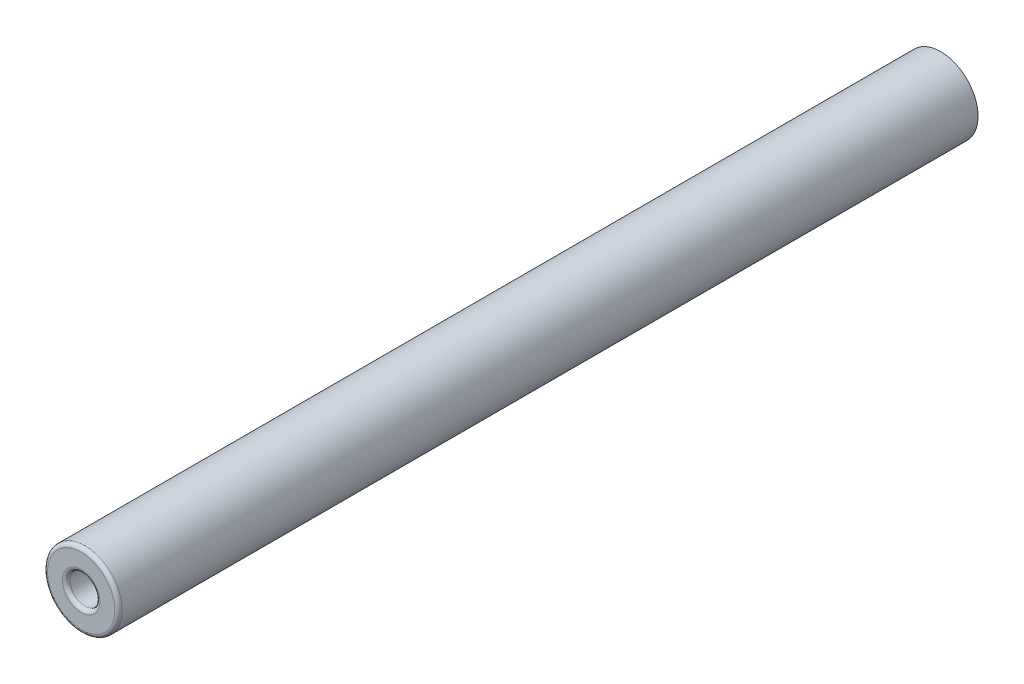
ISO-10303-21;
HEADER;
FILE_DESCRIPTION(('STEP AP214'),'2;1');
FILE_NAME('part.step','',(''),(''),'','','');
FILE_SCHEMA(('AUTOMOTIVE_DESIGN { 1 0 10303 214 1 1 1 1 }'));
ENDSEC;
DATA;
#1=APPLICATION_CONTEXT('core data for automotive mechanical design processes');
#2=APPLICATION_PROTOCOL_DEFINITION('international standard','automotive_design',2000,#1);
#3=PRODUCT_CONTEXT('',#1,'mechanical');
#4=PRODUCT('Part','Part','',(#3));
#5=PRODUCT_RELATED_PRODUCT_CATEGORY('part','',(#4));
#6=PRODUCT_DEFINITION_FORMATION('','',#4);
#7=PRODUCT_DEFINITION_CONTEXT('part definition',#1,'design');
#8=PRODUCT_DEFINITION('design','',#6,#7);
#9=PRODUCT_DEFINITION_SHAPE('','',#8);
#10=(LENGTH_UNIT() NAMED_UNIT(*) SI_UNIT(.MILLI.,.METRE.));
#11=(NAMED_UNIT(*) PLANE_ANGLE_UNIT() SI_UNIT($,.RADIAN.));
#12=(NAMED_UNIT(*) SI_UNIT($,.STERADIAN.) SOLID_ANGLE_UNIT());
#13=UNCERTAINTY_MEASURE_WITH_UNIT(LENGTH_MEASURE(1.E-05),#10,'distance_accuracy_value','');
#14=(GEOMETRIC_REPRESENTATION_CONTEXT(3) GLOBAL_UNCERTAINTY_ASSIGNED_CONTEXT((#13)) GLOBAL_UNIT_ASSIGNED_CONTEXT((#10,
#11,#12)) REPRESENTATION_CONTEXT('',''));
#15=CARTESIAN_POINT('',(0.,0.,0.));
#16=DIRECTION('',(0.,0.,1.));
#17=DIRECTION('',(1.,0.,0.));
#18=AXIS2_PLACEMENT_3D('',#15,#16,#17);
#19=CARTESIAN_POINT('',(0.,0.,68.));
#20=DIRECTION('',(0.,0.,-1.));
#21=DIRECTION('',(-1.,0.,0.));
#22=AXIS2_PLACEMENT_3D('',#19,#20,#21);
#23=CYLINDRICAL_SURFACE('',#22,2.5);
#24=CARTESIAN_POINT('',(0.,0.,67.75));
#25=DIRECTION('',(0.,0.,1.));
#26=DIRECTION('',(1.,0.,0.));
#27=AXIS2_PLACEMENT_3D('',#24,#25,#26);
#28=CIRCLE('',#27,2.5);
#29=CARTESIAN_POINT('',(2.5,0.,67.75));
#30=VERTEX_POINT('',#29);
#31=EDGE_CURVE('E23',#30,#30,#28,.T.);
#32=ORIENTED_EDGE('',*,*,#31,.F.);
#33=EDGE_LOOP('',(#32));
#34=FACE_BOUND('',#33,.T.);
#35=CARTESIAN_POINT('',(0.,0.,10.5));
#36=DIRECTION('',(0.,0.,-1.));
#37=DIRECTION('',(-1.,0.,0.));
#38=AXIS2_PLACEMENT_3D('',#35,#36,#37);
#39=CIRCLE('',#38,2.5);
#40=CARTESIAN_POINT('',(-2.5,0.,10.5));
#41=VERTEX_POINT('',#40);
#42=EDGE_CURVE('E10',#41,#41,#39,.T.);
#43=ORIENTED_EDGE('',*,*,#42,.F.);
#44=EDGE_LOOP('',(#43));
#45=FACE_BOUND('',#44,.T.);
#46=ADVANCED_FACE('F15',(#34,#45),#23,.T.);
#47=CARTESIAN_POINT('',(0.,0.,10.5));
#48=DIRECTION('',(0.,0.,-1.));
#49=DIRECTION('',(-1.,0.,0.));
#50=AXIS2_PLACEMENT_3D('',#47,#48,#49);
#51=PLANE('',#50);
#52=ORIENTED_EDGE('',*,*,#42,.T.);
#53=EDGE_LOOP('',(#52));
#54=FACE_BOUND('',#53,.T.);
#55=ADVANCED_FACE('F56',(#54),#51,.T.);
#56=CARTESIAN_POINT('',(0.,0.,67.75));
#57=DIRECTION('',(0.,0.,1.));
#58=DIRECTION('',(1.,0.,0.));
#59=AXIS2_PLACEMENT_3D('',#56,#57,#58);
#60=TOROIDAL_SURFACE('',#59,2.25,0.25);
#61=ORIENTED_EDGE('',*,*,#31,.T.);
#62=EDGE_LOOP('',(#61));
#63=FACE_BOUND('',#62,.T.);
#64=CARTESIAN_POINT('',(0.,0.,68.));
#65=DIRECTION('',(0.,0.,1.));
#66=DIRECTION('',(-1.,0.,0.));
#67=AXIS2_PLACEMENT_3D('',#64,#65,#66);
#68=CIRCLE('',#67,2.25);
#69=CARTESIAN_POINT('',(-2.25,0.,68.));
#70=VERTEX_POINT('',#69);
#71=EDGE_CURVE('E28',#70,#70,#68,.T.);
#72=ORIENTED_EDGE('',*,*,#71,.F.);
#73=EDGE_LOOP('',(#72));
#74=FACE_BOUND('',#73,.T.);
#75=ADVANCED_FACE('F62',(#63,#74),#60,.T.);
#76=CARTESIAN_POINT('',(0.,0.,68.));
#77=DIRECTION('',(0.,0.,1.));
#78=DIRECTION('',(1.,0.,0.));
#79=AXIS2_PLACEMENT_3D('',#76,#77,#78);
#80=PLANE('',#79);
#81=ORIENTED_EDGE('',*,*,#71,.T.);
#82=EDGE_LOOP('',(#81));
#83=FACE_BOUND('',#82,.T.);
#84=CARTESIAN_POINT('',(0.,0.,68.));
#85=DIRECTION('',(0.,0.,-1.));
#86=DIRECTION('',(-1.,0.,0.));
#87=AXIS2_PLACEMENT_3D('',#84,#85,#86);
#88=CIRCLE('',#87,1.25);
#89=CARTESIAN_POINT('',(-1.25,0.,68.));
#90=VERTEX_POINT('',#89);
#91=EDGE_CURVE('E33',#90,#90,#88,.T.);
#92=ORIENTED_EDGE('',*,*,#91,.T.);
#93=EDGE_LOOP('',(#92));
#94=FACE_BOUND('',#93,.T.);
#95=ADVANCED_FACE('F52',(#83,#94),#80,.T.);
#96=CARTESIAN_POINT('',(0.,0.,67.75));
#97=DIRECTION('',(0.,0.,1.));
#98=DIRECTION('',(1.,0.,0.));
#99=AXIS2_PLACEMENT_3D('',#96,#97,#98);
#100=TOROIDAL_SURFACE('',#99,1.25,0.25);
#101=ORIENTED_EDGE('',*,*,#91,.F.);
#102=EDGE_LOOP('',(#101));
#103=FACE_BOUND('',#102,.T.);
#104=CARTESIAN_POINT('',(0.,0.,67.75));
#105=DIRECTION('',(0.,0.,-1.));
#106=DIRECTION('',(1.,0.,0.));
#107=AXIS2_PLACEMENT_3D('',#104,#105,#106);
#108=CIRCLE('',#107,1.);
#109=CARTESIAN_POINT('',(1.,0.,67.75));
#110=VERTEX_POINT('',#109);
#111=EDGE_CURVE('E35',#110,#110,#108,.T.);
#112=ORIENTED_EDGE('',*,*,#111,.T.);
#113=EDGE_LOOP('',(#112));
#114=FACE_BOUND('',#113,.T.);
#115=ADVANCED_FACE('F46',(#103,#114),#100,.T.);
#116=CARTESIAN_POINT('',(0.,0.,58.));
#117=DIRECTION('',(0.,0.,1.));
#118=DIRECTION('',(1.,0.,0.));
#119=AXIS2_PLACEMENT_3D('',#116,#117,#118);
#120=CYLINDRICAL_SURFACE('',#119,1.);
#121=CARTESIAN_POINT('',(0.,0.,58.));
#122=DIRECTION('',(0.,0.,1.));
#123=DIRECTION('',(1.,0.,0.));
#124=AXIS2_PLACEMENT_3D('',#121,#122,#123);
#125=CIRCLE('',#124,1.);
#126=CARTESIAN_POINT('',(1.,0.,58.));
#127=VERTEX_POINT('',#126);
#128=EDGE_CURVE('E19',#127,#127,#125,.T.);
#129=ORIENTED_EDGE('',*,*,#128,.F.);
#130=EDGE_LOOP('',(#129));
#131=FACE_BOUND('',#130,.T.);
#132=ORIENTED_EDGE('',*,*,#111,.F.);
#133=EDGE_LOOP('',(#132));
#134=FACE_BOUND('',#133,.T.);
#135=ADVANCED_FACE('F43',(#131,#134),#120,.F.);
#136=CARTESIAN_POINT('',(0.,0.,58.));
#137=DIRECTION('',(0.,0.,1.));
#138=DIRECTION('',(1.,0.,0.));
#139=AXIS2_PLACEMENT_3D('',#136,#137,#138);
#140=PLANE('',#139);
#141=ORIENTED_EDGE('',*,*,#128,.T.);
#142=EDGE_LOOP('',(#141));
#143=FACE_BOUND('',#142,.T.);
#144=ADVANCED_FACE('F17',(#143),#140,.T.);
#145=CLOSED_SHELL('',(#46,#55,#75,#95,#115,#135,#144));
#146=MANIFOLD_SOLID_BREP('B1',#145);
#147=ADVANCED_BREP_SHAPE_REPRESENTATION('',(#18,#146),#14);
#148=SHAPE_DEFINITION_REPRESENTATION(#9,#147);
ENDSEC;
END-ISO-10303-21;
